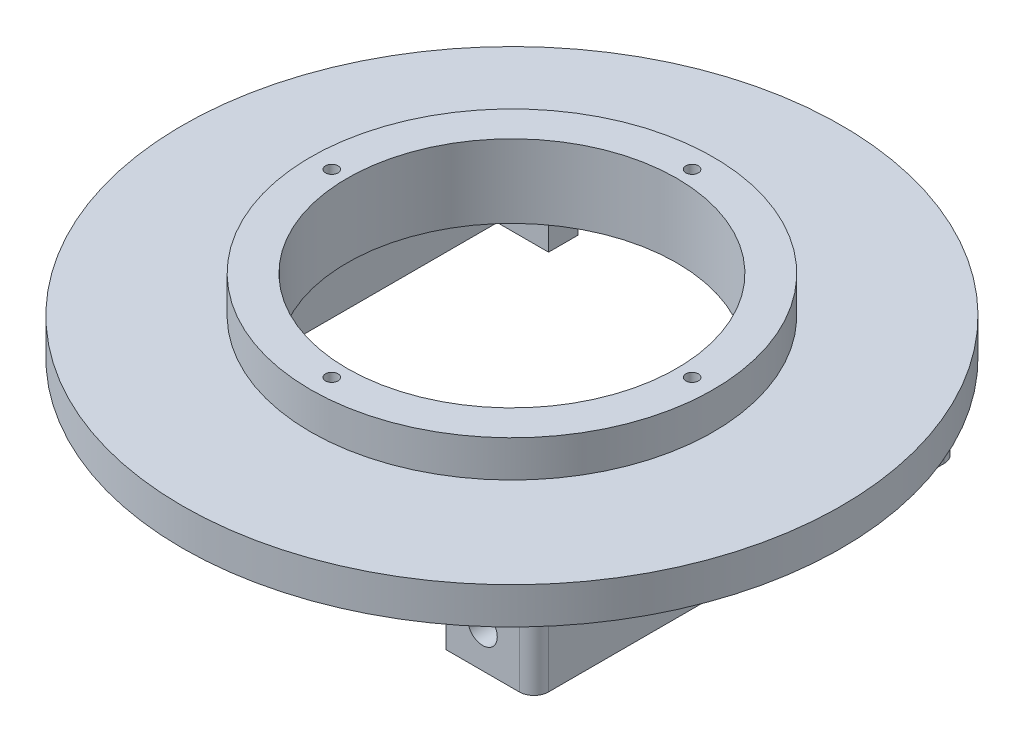
ISO-10303-21;
HEADER;
FILE_DESCRIPTION(('STEP AP214'),'2;1');
FILE_NAME('part.step','',(''),(''),'','','');
FILE_SCHEMA(('AUTOMOTIVE_DESIGN { 1 0 10303 214 1 1 1 1 }'));
ENDSEC;
DATA;
#1=APPLICATION_CONTEXT('core data for automotive mechanical design processes');
#2=APPLICATION_PROTOCOL_DEFINITION('international standard','automotive_design',2000,#1);
#3=PRODUCT_CONTEXT('',#1,'mechanical');
#4=PRODUCT('Part','Part','',(#3));
#5=PRODUCT_RELATED_PRODUCT_CATEGORY('part','',(#4));
#6=PRODUCT_DEFINITION_FORMATION('','',#4);
#7=PRODUCT_DEFINITION_CONTEXT('part definition',#1,'design');
#8=PRODUCT_DEFINITION('design','',#6,#7);
#9=PRODUCT_DEFINITION_SHAPE('','',#8);
#10=(LENGTH_UNIT() NAMED_UNIT(*) SI_UNIT(.MILLI.,.METRE.));
#11=(NAMED_UNIT(*) PLANE_ANGLE_UNIT() SI_UNIT($,.RADIAN.));
#12=(NAMED_UNIT(*) SI_UNIT($,.STERADIAN.) SOLID_ANGLE_UNIT());
#13=UNCERTAINTY_MEASURE_WITH_UNIT(LENGTH_MEASURE(1.E-05),#10,'distance_accuracy_value','');
#14=(GEOMETRIC_REPRESENTATION_CONTEXT(3) GLOBAL_UNCERTAINTY_ASSIGNED_CONTEXT((#13)) GLOBAL_UNIT_ASSIGNED_CONTEXT((#10,
#11,#12)) REPRESENTATION_CONTEXT('',''));
#15=CARTESIAN_POINT('',(0.,0.,0.));
#16=DIRECTION('',(0.,0.,1.));
#17=DIRECTION('',(1.,0.,0.));
#18=AXIS2_PLACEMENT_3D('',#15,#16,#17);
#19=CARTESIAN_POINT('',(0.,5.,0.));
#20=DIRECTION('',(0.,1.,0.));
#21=DIRECTION('',(0.,0.,1.));
#22=AXIS2_PLACEMENT_3D('',#19,#20,#21);
#23=PLANE('',#22);
#24=CARTESIAN_POINT('',(0.,5.,0.));
#25=DIRECTION('',(0.,1.,0.));
#26=DIRECTION('',(0.,0.,1.));
#27=AXIS2_PLACEMENT_3D('',#24,#25,#26);
#28=CIRCLE('',#27,45.);
#29=CARTESIAN_POINT('',(0.,5.,45.));
#30=VERTEX_POINT('',#29);
#31=EDGE_CURVE('E321',#30,#30,#28,.T.);
#32=ORIENTED_EDGE('',*,*,#31,.T.);
#33=EDGE_LOOP('',(#32));
#34=FACE_BOUND('',#33,.T.);
#35=CARTESIAN_POINT('',(0.,5.,0.));
#36=DIRECTION('',(0.,1.,0.));
#37=DIRECTION('',(0.,0.,1.));
#38=AXIS2_PLACEMENT_3D('',#35,#36,#37);
#39=CIRCLE('',#38,27.5);
#40=CARTESIAN_POINT('',(0.,5.,27.5));
#41=VERTEX_POINT('',#40);
#42=EDGE_CURVE('E519',#41,#41,#39,.T.);
#43=ORIENTED_EDGE('',*,*,#42,.F.);
#44=EDGE_LOOP('',(#43));
#45=FACE_BOUND('',#44,.T.);
#46=ADVANCED_FACE('F33',(#34,#45),#23,.T.);
#47=CARTESIAN_POINT('',(0.,0.,0.));
#48=DIRECTION('',(0.,1.,0.));
#49=DIRECTION('',(0.,0.,1.));
#50=AXIS2_PLACEMENT_3D('',#47,#48,#49);
#51=PLANE('',#50);
#52=CARTESIAN_POINT('',(-24.5999999999993,0.,6.99174051987939E-13));
#53=DIRECTION('',(0.,1.,0.));
#54=DIRECTION('',(0.,0.,1.));
#55=AXIS2_PLACEMENT_3D('',#52,#53,#54);
#56=CIRCLE('',#55,0.850000000001118);
#57=CARTESIAN_POINT('',(-24.5999999999993,0.,0.850000000001817));
#58=VERTEX_POINT('',#57);
#59=EDGE_CURVE('E772',#58,#58,#56,.T.);
#60=ORIENTED_EDGE('',*,*,#59,.T.);
#61=EDGE_LOOP('',(#60));
#62=FACE_BOUND('',#61,.T.);
#63=CARTESIAN_POINT('',(1.39304567458361E-12,0.,24.6));
#64=DIRECTION('',(0.,1.,0.));
#65=DIRECTION('',(0.,0.,1.));
#66=AXIS2_PLACEMENT_3D('',#63,#64,#65);
#67=CIRCLE('',#66,0.850000000001497);
#68=CARTESIAN_POINT('',(1.39304567458361E-12,0.,25.4500000000015));
#69=VERTEX_POINT('',#68);
#70=EDGE_CURVE('E776',#69,#69,#67,.T.);
#71=ORIENTED_EDGE('',*,*,#70,.T.);
#72=EDGE_LOOP('',(#71));
#73=FACE_BOUND('',#72,.T.);
#74=CARTESIAN_POINT('',(24.6000000000007,0.,-6.96161420862036E-13));
#75=DIRECTION('',(0.,1.,0.));
#76=DIRECTION('',(0.,0.,1.));
#77=AXIS2_PLACEMENT_3D('',#74,#75,#76);
#78=CIRCLE('',#77,0.850000000000545);
#79=CARTESIAN_POINT('',(24.6000000000007,0.,0.849999999999848));
#80=VERTEX_POINT('',#79);
#81=EDGE_CURVE('E785',#80,#80,#78,.T.);
#82=ORIENTED_EDGE('',*,*,#81,.T.);
#83=EDGE_LOOP('',(#82));
#84=FACE_BOUND('',#83,.T.);
#85=CARTESIAN_POINT('',(0.,0.,-24.6));
#86=DIRECTION('',(0.,1.,0.));
#87=DIRECTION('',(0.,0.,1.));
#88=AXIS2_PLACEMENT_3D('',#85,#86,#87);
#89=CIRCLE('',#88,0.85);
#90=CARTESIAN_POINT('',(0.,0.,-23.75));
#91=VERTEX_POINT('',#90);
#92=EDGE_CURVE('E520',#91,#91,#89,.T.);
#93=ORIENTED_EDGE('',*,*,#92,.T.);
#94=EDGE_LOOP('',(#93));
#95=FACE_BOUND('',#94,.T.);
#96=DIRECTION('',(1.,0.,0.));
#97=VECTOR('',#96,1.);
#98=CARTESIAN_POINT('',(-20.,0.,25.));
#99=LINE('',#98,#97);
#100=CARTESIAN_POINT('',(-27.,0.,25.));
#101=VERTEX_POINT('',#100);
#102=CARTESIAN_POINT('',(-20.,0.,25.));
#103=VERTEX_POINT('',#102);
#104=EDGE_CURVE('E201',#101,#103,#99,.T.);
#105=ORIENTED_EDGE('',*,*,#104,.F.);
#106=DIRECTION('',(0.,0.,1.));
#107=VECTOR('',#106,1.);
#108=CARTESIAN_POINT('',(-27.,0.,25.));
#109=LINE('',#108,#107);
#110=CARTESIAN_POINT('',(-27.,0.,-25.));
#111=VERTEX_POINT('',#110);
#112=EDGE_CURVE('E260',#111,#101,#109,.T.);
#113=ORIENTED_EDGE('',*,*,#112,.F.);
#114=DIRECTION('',(-1.,0.,0.));
#115=VECTOR('',#114,1.);
#116=CARTESIAN_POINT('',(-20.,0.,-25.));
#117=LINE('',#116,#115);
#118=CARTESIAN_POINT('',(-20.,0.,-25.));
#119=VERTEX_POINT('',#118);
#120=EDGE_CURVE('E293',#119,#111,#117,.T.);
#121=ORIENTED_EDGE('',*,*,#120,.F.);
#122=DIRECTION('',(0.,0.,1.));
#123=VECTOR('',#122,1.);
#124=CARTESIAN_POINT('',(-20.,0.,-29.));
#125=LINE('',#124,#123);
#126=CARTESIAN_POINT('',(-20.,0.,-29.));
#127=VERTEX_POINT('',#126);
#128=EDGE_CURVE('E290',#127,#119,#125,.T.);
#129=ORIENTED_EDGE('',*,*,#128,.F.);
#130=DIRECTION('',(1.,0.,0.));
#131=VECTOR('',#130,1.);
#132=CARTESIAN_POINT('',(-32.,0.,-29.));
#133=LINE('',#132,#131);
#134=CARTESIAN_POINT('',(-30.,0.,-29.));
#135=VERTEX_POINT('',#134);
#136=EDGE_CURVE('E288',#135,#127,#133,.T.);
#137=ORIENTED_EDGE('',*,*,#136,.F.);
#138=CARTESIAN_POINT('',(-30.,0.,-27.));
#139=DIRECTION('',(0.,1.,0.));
#140=DIRECTION('',(0.,0.,1.));
#141=AXIS2_PLACEMENT_3D('',#138,#139,#140);
#142=CIRCLE('',#141,2.);
#143=CARTESIAN_POINT('',(-32.,0.,-27.));
#144=VERTEX_POINT('',#143);
#145=EDGE_CURVE('E352',#135,#144,#142,.T.);
#146=ORIENTED_EDGE('',*,*,#145,.T.);
#147=DIRECTION('',(0.,0.,-1.));
#148=VECTOR('',#147,1.);
#149=CARTESIAN_POINT('',(-32.,0.,-25.));
#150=LINE('',#149,#148);
#151=CARTESIAN_POINT('',(-32.0000000000001,0.,27.));
#152=VERTEX_POINT('',#151);
#153=EDGE_CURVE('E285',#152,#144,#150,.T.);
#154=ORIENTED_EDGE('',*,*,#153,.F.);
#155=CARTESIAN_POINT('',(-30.0000000000001,0.,27.));
#156=DIRECTION('',(0.,1.,0.));
#157=DIRECTION('',(0.,0.,1.));
#158=AXIS2_PLACEMENT_3D('',#155,#156,#157);
#159=CIRCLE('',#158,2.);
#160=CARTESIAN_POINT('',(-30.0000000000001,0.,29.));
#161=VERTEX_POINT('',#160);
#162=EDGE_CURVE('E11',#152,#161,#159,.T.);
#163=ORIENTED_EDGE('',*,*,#162,.T.);
#164=DIRECTION('',(-1.,0.,0.));
#165=VECTOR('',#164,1.);
#166=CARTESIAN_POINT('',(-32.,0.,29.));
#167=LINE('',#166,#165);
#168=CARTESIAN_POINT('',(-20.,0.,29.));
#169=VERTEX_POINT('',#168);
#170=EDGE_CURVE('E282',#169,#161,#167,.T.);
#171=ORIENTED_EDGE('',*,*,#170,.F.);
#172=DIRECTION('',(0.,0.,1.));
#173=VECTOR('',#172,1.);
#174=CARTESIAN_POINT('',(-20.,0.,29.));
#175=LINE('',#174,#173);
#176=EDGE_CURVE('E279',#103,#169,#175,.T.);
#177=ORIENTED_EDGE('',*,*,#176,.F.);
#178=EDGE_LOOP('',(#105,#113,#121,#129,#137,#146,#154,#163,#171,#177));
#179=FACE_BOUND('',#178,.T.);
#180=CARTESIAN_POINT('',(0.,0.,0.));
#181=DIRECTION('',(0.,1.,0.));
#182=DIRECTION('',(0.,0.,1.));
#183=AXIS2_PLACEMENT_3D('',#180,#181,#182);
#184=CIRCLE('',#183,45.);
#185=CARTESIAN_POINT('',(0.,0.,45.));
#186=VERTEX_POINT('',#185);
#187=EDGE_CURVE('E320',#186,#186,#184,.T.);
#188=ORIENTED_EDGE('',*,*,#187,.F.);
#189=EDGE_LOOP('',(#188));
#190=FACE_BOUND('',#189,.T.);
#191=CARTESIAN_POINT('',(0.,0.,0.));
#192=DIRECTION('',(0.,1.,0.));
#193=DIRECTION('',(0.,0.,1.));
#194=AXIS2_PLACEMENT_3D('',#191,#192,#193);
#195=CIRCLE('',#194,22.5);
#196=CARTESIAN_POINT('',(0.,0.,22.5));
#197=VERTEX_POINT('',#196);
#198=EDGE_CURVE('E317',#197,#197,#195,.T.);
#199=ORIENTED_EDGE('',*,*,#198,.T.);
#200=EDGE_LOOP('',(#199));
#201=FACE_BOUND('',#200,.T.);
#202=DIRECTION('',(1.,0.,0.));
#203=VECTOR('',#202,1.);
#204=CARTESIAN_POINT('',(32.,0.,-29.));
#205=LINE('',#204,#203);
#206=CARTESIAN_POINT('',(20.,0.,-29.));
#207=VERTEX_POINT('',#206);
#208=CARTESIAN_POINT('',(30.0000000000003,0.,-29.));
#209=VERTEX_POINT('',#208);
#210=EDGE_CURVE('E219',#207,#209,#205,.T.);
#211=ORIENTED_EDGE('',*,*,#210,.F.);
#212=DIRECTION('',(0.,0.,-1.));
#213=VECTOR('',#212,1.);
#214=CARTESIAN_POINT('',(20.,0.,-29.));
#215=LINE('',#214,#213);
#216=CARTESIAN_POINT('',(20.,0.,-25.));
#217=VERTEX_POINT('',#216);
#218=EDGE_CURVE('E238',#217,#207,#215,.T.);
#219=ORIENTED_EDGE('',*,*,#218,.F.);
#220=DIRECTION('',(-1.,0.,0.));
#221=VECTOR('',#220,1.);
#222=CARTESIAN_POINT('',(20.,0.,-25.));
#223=LINE('',#222,#221);
#224=CARTESIAN_POINT('',(27.,0.,-25.));
#225=VERTEX_POINT('',#224);
#226=EDGE_CURVE('E235',#225,#217,#223,.T.);
#227=ORIENTED_EDGE('',*,*,#226,.F.);
#228=DIRECTION('',(0.,0.,-1.));
#229=VECTOR('',#228,1.);
#230=CARTESIAN_POINT('',(27.,0.,25.));
#231=LINE('',#230,#229);
#232=CARTESIAN_POINT('',(27.,0.,25.));
#233=VERTEX_POINT('',#232);
#234=EDGE_CURVE('E232',#233,#225,#231,.T.);
#235=ORIENTED_EDGE('',*,*,#234,.F.);
#236=DIRECTION('',(1.,0.,0.));
#237=VECTOR('',#236,1.);
#238=CARTESIAN_POINT('',(20.,0.,25.));
#239=LINE('',#238,#237);
#240=CARTESIAN_POINT('',(20.,0.,25.));
#241=VERTEX_POINT('',#240);
#242=EDGE_CURVE('E229',#241,#233,#239,.T.);
#243=ORIENTED_EDGE('',*,*,#242,.F.);
#244=DIRECTION('',(0.,0.,-1.));
#245=VECTOR('',#244,1.);
#246=CARTESIAN_POINT('',(20.,0.,29.));
#247=LINE('',#246,#245);
#248=CARTESIAN_POINT('',(20.,0.,29.));
#249=VERTEX_POINT('',#248);
#250=EDGE_CURVE('E227',#249,#241,#247,.T.);
#251=ORIENTED_EDGE('',*,*,#250,.F.);
#252=DIRECTION('',(-1.,0.,0.));
#253=VECTOR('',#252,1.);
#254=CARTESIAN_POINT('',(32.,0.,29.));
#255=LINE('',#254,#253);
#256=CARTESIAN_POINT('',(30.,0.,29.));
#257=VERTEX_POINT('',#256);
#258=EDGE_CURVE('E197',#257,#249,#255,.T.);
#259=ORIENTED_EDGE('',*,*,#258,.F.);
#260=CARTESIAN_POINT('',(30.,0.,27.));
#261=DIRECTION('',(0.,1.,0.));
#262=DIRECTION('',(0.,0.,1.));
#263=AXIS2_PLACEMENT_3D('',#260,#261,#262);
#264=CIRCLE('',#263,2.);
#265=CARTESIAN_POINT('',(32.,0.,27.));
#266=VERTEX_POINT('',#265);
#267=EDGE_CURVE('E42',#257,#266,#264,.T.);
#268=ORIENTED_EDGE('',*,*,#267,.T.);
#269=DIRECTION('',(0.,0.,1.));
#270=VECTOR('',#269,1.);
#271=CARTESIAN_POINT('',(32.,0.,25.));
#272=LINE('',#271,#270);
#273=CARTESIAN_POINT('',(32.0000000000003,0.,-27.));
#274=VERTEX_POINT('',#273);
#275=EDGE_CURVE('E222',#274,#266,#272,.T.);
#276=ORIENTED_EDGE('',*,*,#275,.F.);
#277=CARTESIAN_POINT('',(30.0000000000003,0.,-27.));
#278=DIRECTION('',(0.,1.,0.));
#279=DIRECTION('',(0.,0.,1.));
#280=AXIS2_PLACEMENT_3D('',#277,#278,#279);
#281=CIRCLE('',#280,2.);
#282=EDGE_CURVE('E354',#274,#209,#281,.T.);
#283=ORIENTED_EDGE('',*,*,#282,.T.);
#284=EDGE_LOOP('',(#211,#219,#227,#235,#243,#251,#259,#268,#276,#283));
#285=FACE_BOUND('',#284,.T.);
#286=ADVANCED_FACE('F358',(#62,#73,#84,#95,#179,#190,#201,#285),#51,.F.);
#287=CARTESIAN_POINT('',(0.,5.,0.));
#288=DIRECTION('',(0.,-1.,0.));
#289=DIRECTION('',(0.,0.,-1.));
#290=AXIS2_PLACEMENT_3D('',#287,#288,#289);
#291=CYLINDRICAL_SURFACE('',#290,45.);
#292=ORIENTED_EDGE('',*,*,#31,.F.);
#293=EDGE_LOOP('',(#292));
#294=FACE_BOUND('',#293,.T.);
#295=ORIENTED_EDGE('',*,*,#187,.T.);
#296=EDGE_LOOP('',(#295));
#297=FACE_BOUND('',#296,.T.);
#298=ADVANCED_FACE('F385',(#294,#297),#291,.T.);
#299=CARTESIAN_POINT('',(0.,5.,0.));
#300=DIRECTION('',(0.,-1.,0.));
#301=DIRECTION('',(0.,0.,-1.));
#302=AXIS2_PLACEMENT_3D('',#299,#300,#301);
#303=CYLINDRICAL_SURFACE('',#302,22.5);
#304=ORIENTED_EDGE('',*,*,#198,.F.);
#305=EDGE_LOOP('',(#304));
#306=FACE_BOUND('',#305,.T.);
#307=CARTESIAN_POINT('',(0.,10.,0.));
#308=DIRECTION('',(0.,1.,0.));
#309=DIRECTION('',(0.,0.,1.));
#310=AXIS2_PLACEMENT_3D('',#307,#308,#309);
#311=CIRCLE('',#310,22.5);
#312=CARTESIAN_POINT('',(0.,10.,22.5));
#313=VERTEX_POINT('',#312);
#314=EDGE_CURVE('E517',#313,#313,#311,.T.);
#315=ORIENTED_EDGE('',*,*,#314,.T.);
#316=EDGE_LOOP('',(#315));
#317=FACE_BOUND('',#316,.T.);
#318=ADVANCED_FACE('F390',(#306,#317),#303,.F.);
#319=CARTESIAN_POINT('',(-20.,-10.,25.));
#320=DIRECTION('',(0.,0.,1.));
#321=DIRECTION('',(1.,0.,0.));
#322=AXIS2_PLACEMENT_3D('',#319,#320,#321);
#323=PLANE('',#322);
#324=DIRECTION('',(0.,1.,0.));
#325=VECTOR('',#324,1.);
#326=CARTESIAN_POINT('',(-27.,-10.,25.));
#327=LINE('',#326,#325);
#328=CARTESIAN_POINT('',(-27.,-10.,25.));
#329=VERTEX_POINT('',#328);
#330=CARTESIAN_POINT('',(-27.,-5.,25.));
#331=VERTEX_POINT('',#330);
#332=EDGE_CURVE('E298',#329,#331,#327,.T.);
#333=ORIENTED_EDGE('',*,*,#332,.T.);
#334=CARTESIAN_POINT('',(-25.,-5.,25.));
#335=DIRECTION('',(0.,0.,1.));
#336=DIRECTION('',(1.,0.,0.));
#337=AXIS2_PLACEMENT_3D('',#334,#335,#336);
#338=CIRCLE('',#337,2.);
#339=EDGE_CURVE('E452',#331,#331,#338,.T.);
#340=ORIENTED_EDGE('',*,*,#339,.T.);
#341=EDGE_CURVE('E276',#331,#101,#327,.T.);
#342=ORIENTED_EDGE('',*,*,#341,.T.);
#343=ORIENTED_EDGE('',*,*,#104,.T.);
#344=DIRECTION('',(0.,1.,0.));
#345=VECTOR('',#344,1.);
#346=CARTESIAN_POINT('',(-20.,-10.,25.));
#347=LINE('',#346,#345);
#348=CARTESIAN_POINT('',(-20.,-10.,25.));
#349=VERTEX_POINT('',#348);
#350=EDGE_CURVE('E314',#349,#103,#347,.T.);
#351=ORIENTED_EDGE('',*,*,#350,.F.);
#352=DIRECTION('',(1.,0.,0.));
#353=VECTOR('',#352,1.);
#354=CARTESIAN_POINT('',(-20.,-10.,25.));
#355=LINE('',#354,#353);
#356=EDGE_CURVE('E256',#329,#349,#355,.T.);
#357=ORIENTED_EDGE('',*,*,#356,.F.);
#358=EDGE_LOOP('',(#333,#340,#342,#343,#351,#357));
#359=FACE_BOUND('',#358,.T.);
#360=ADVANCED_FACE('F435',(#359),#323,.F.);
#361=CARTESIAN_POINT('',(-20.,-10.,29.));
#362=DIRECTION('',(-1.,0.,0.));
#363=DIRECTION('',(0.,0.,1.));
#364=AXIS2_PLACEMENT_3D('',#361,#362,#363);
#365=PLANE('',#364);
#366=ORIENTED_EDGE('',*,*,#176,.T.);
#367=DIRECTION('',(0.,1.,0.));
#368=VECTOR('',#367,1.);
#369=CARTESIAN_POINT('',(-20.,-10.,29.));
#370=LINE('',#369,#368);
#371=CARTESIAN_POINT('',(-20.,-10.,29.));
#372=VERTEX_POINT('',#371);
#373=EDGE_CURVE('E311',#372,#169,#370,.T.);
#374=ORIENTED_EDGE('',*,*,#373,.F.);
#375=DIRECTION('',(0.,0.,1.));
#376=VECTOR('',#375,1.);
#377=CARTESIAN_POINT('',(-20.,-10.,29.));
#378=LINE('',#377,#376);
#379=EDGE_CURVE('E259',#349,#372,#378,.T.);
#380=ORIENTED_EDGE('',*,*,#379,.F.);
#381=ORIENTED_EDGE('',*,*,#350,.T.);
#382=EDGE_LOOP('',(#366,#374,#380,#381));
#383=FACE_BOUND('',#382,.T.);
#384=ADVANCED_FACE('F440',(#383),#365,.F.);
#385=CARTESIAN_POINT('',(-32.,-10.,29.));
#386=DIRECTION('',(0.,0.,-1.));
#387=DIRECTION('',(-1.,0.,0.));
#388=AXIS2_PLACEMENT_3D('',#385,#386,#387);
#389=PLANE('',#388);
#390=CARTESIAN_POINT('',(-25.,-5.,29.));
#391=DIRECTION('',(0.,0.,1.));
#392=DIRECTION('',(1.,0.,0.));
#393=AXIS2_PLACEMENT_3D('',#390,#391,#392);
#394=CIRCLE('',#393,2.);
#395=CARTESIAN_POINT('',(-23.,-5.,29.));
#396=VERTEX_POINT('',#395);
#397=EDGE_CURVE('E457',#396,#396,#394,.T.);
#398=ORIENTED_EDGE('',*,*,#397,.F.);
#399=EDGE_LOOP('',(#398));
#400=FACE_BOUND('',#399,.T.);
#401=ORIENTED_EDGE('',*,*,#170,.T.);
#402=DIRECTION('',(0.,1.,0.));
#403=VECTOR('',#402,1.);
#404=CARTESIAN_POINT('',(-30.0000000000001,-10.,29.));
#405=LINE('',#404,#403);
#406=CARTESIAN_POINT('',(-30.0000000000001,-10.,29.));
#407=VERTEX_POINT('',#406);
#408=EDGE_CURVE('E350',#161,#407,#405,.F.);
#409=ORIENTED_EDGE('',*,*,#408,.T.);
#410=DIRECTION('',(-1.,0.,0.));
#411=VECTOR('',#410,1.);
#412=CARTESIAN_POINT('',(-32.,-10.,29.));
#413=LINE('',#412,#411);
#414=EDGE_CURVE('E262',#372,#407,#413,.T.);
#415=ORIENTED_EDGE('',*,*,#414,.F.);
#416=ORIENTED_EDGE('',*,*,#373,.T.);
#417=EDGE_LOOP('',(#401,#409,#415,#416));
#418=FACE_BOUND('',#417,.T.);
#419=ADVANCED_FACE('F442',(#400,#418),#389,.F.);
#420=CARTESIAN_POINT('',(-32.,-10.,-25.));
#421=DIRECTION('',(1.,0.,0.));
#422=DIRECTION('',(0.,0.,-1.));
#423=AXIS2_PLACEMENT_3D('',#420,#421,#422);
#424=PLANE('',#423);
#425=ORIENTED_EDGE('',*,*,#153,.T.);
#426=DIRECTION('',(0.,1.,0.));
#427=VECTOR('',#426,1.);
#428=CARTESIAN_POINT('',(-32.,-10.,-27.));
#429=LINE('',#428,#427);
#430=CARTESIAN_POINT('',(-32.0000000000001,-10.,-27.));
#431=VERTEX_POINT('',#430);
#432=EDGE_CURVE('E332',#144,#431,#429,.F.);
#433=ORIENTED_EDGE('',*,*,#432,.T.);
#434=DIRECTION('',(0.,0.,-1.));
#435=VECTOR('',#434,1.);
#436=CARTESIAN_POINT('',(-32.,-10.,25.));
#437=LINE('',#436,#435);
#438=CARTESIAN_POINT('',(-32.,-10.,27.));
#439=VERTEX_POINT('',#438);
#440=EDGE_CURVE('E265',#439,#431,#437,.T.);
#441=ORIENTED_EDGE('',*,*,#440,.F.);
#442=DIRECTION('',(0.,1.,0.));
#443=VECTOR('',#442,1.);
#444=CARTESIAN_POINT('',(-32.0000000000001,-10.,27.));
#445=LINE('',#444,#443);
#446=EDGE_CURVE('E329',#439,#152,#445,.T.);
#447=ORIENTED_EDGE('',*,*,#446,.T.);
#448=EDGE_LOOP('',(#425,#433,#441,#447));
#449=FACE_BOUND('',#448,.T.);
#450=ADVANCED_FACE('F446',(#449),#424,.F.);
#451=CARTESIAN_POINT('',(-32.,-10.,-29.));
#452=DIRECTION('',(0.,0.,1.));
#453=DIRECTION('',(1.,0.,0.));
#454=AXIS2_PLACEMENT_3D('',#451,#452,#453);
#455=PLANE('',#454);
#456=CARTESIAN_POINT('',(-25.,-5.,-29.));
#457=DIRECTION('',(0.,0.,1.));
#458=DIRECTION('',(1.,0.,0.));
#459=AXIS2_PLACEMENT_3D('',#456,#457,#458);
#460=CIRCLE('',#459,2.);
#461=CARTESIAN_POINT('',(-23.,-5.,-29.));
#462=VERTEX_POINT('',#461);
#463=EDGE_CURVE('E223',#462,#462,#460,.T.);
#464=ORIENTED_EDGE('',*,*,#463,.T.);
#465=EDGE_LOOP('',(#464));
#466=FACE_BOUND('',#465,.T.);
#467=DIRECTION('',(1.,0.,0.));
#468=VECTOR('',#467,1.);
#469=CARTESIAN_POINT('',(-32.,-10.,-29.));
#470=LINE('',#469,#468);
#471=CARTESIAN_POINT('',(-30.,-10.,-29.));
#472=VERTEX_POINT('',#471);
#473=CARTESIAN_POINT('',(-20.,-10.,-29.));
#474=VERTEX_POINT('',#473);
#475=EDGE_CURVE('E268',#472,#474,#470,.T.);
#476=ORIENTED_EDGE('',*,*,#475,.F.);
#477=DIRECTION('',(0.,1.,0.));
#478=VECTOR('',#477,1.);
#479=CARTESIAN_POINT('',(-30.,-10.,-29.));
#480=LINE('',#479,#478);
#481=EDGE_CURVE('E324',#472,#135,#480,.T.);
#482=ORIENTED_EDGE('',*,*,#481,.T.);
#483=ORIENTED_EDGE('',*,*,#136,.T.);
#484=DIRECTION('',(0.,1.,0.));
#485=VECTOR('',#484,1.);
#486=CARTESIAN_POINT('',(-20.,-10.,-29.));
#487=LINE('',#486,#485);
#488=EDGE_CURVE('E308',#474,#127,#487,.T.);
#489=ORIENTED_EDGE('',*,*,#488,.F.);
#490=EDGE_LOOP('',(#476,#482,#483,#489));
#491=FACE_BOUND('',#490,.T.);
#492=ADVANCED_FACE('F412',(#466,#491),#455,.F.);
#493=CARTESIAN_POINT('',(-20.,-10.,-29.));
#494=DIRECTION('',(-1.,0.,0.));
#495=DIRECTION('',(0.,0.,1.));
#496=AXIS2_PLACEMENT_3D('',#493,#494,#495);
#497=PLANE('',#496);
#498=ORIENTED_EDGE('',*,*,#128,.T.);
#499=DIRECTION('',(0.,1.,0.));
#500=VECTOR('',#499,1.);
#501=CARTESIAN_POINT('',(-20.,-10.,-25.));
#502=LINE('',#501,#500);
#503=CARTESIAN_POINT('',(-20.,-10.,-25.));
#504=VERTEX_POINT('',#503);
#505=EDGE_CURVE('E305',#504,#119,#502,.T.);
#506=ORIENTED_EDGE('',*,*,#505,.F.);
#507=DIRECTION('',(0.,0.,1.));
#508=VECTOR('',#507,1.);
#509=CARTESIAN_POINT('',(-20.,-10.,-29.));
#510=LINE('',#509,#508);
#511=EDGE_CURVE('E270',#474,#504,#510,.T.);
#512=ORIENTED_EDGE('',*,*,#511,.F.);
#513=ORIENTED_EDGE('',*,*,#488,.T.);
#514=EDGE_LOOP('',(#498,#506,#512,#513));
#515=FACE_BOUND('',#514,.T.);
#516=ADVANCED_FACE('F418',(#515),#497,.F.);
#517=CARTESIAN_POINT('',(-20.,-10.,-25.));
#518=DIRECTION('',(0.,0.,-1.));
#519=DIRECTION('',(-1.,0.,0.));
#520=AXIS2_PLACEMENT_3D('',#517,#518,#519);
#521=PLANE('',#520);
#522=DIRECTION('',(0.,1.,0.));
#523=VECTOR('',#522,1.);
#524=CARTESIAN_POINT('',(-27.,-10.,-25.));
#525=LINE('',#524,#523);
#526=CARTESIAN_POINT('',(-27.,-5.,-25.));
#527=VERTEX_POINT('',#526);
#528=EDGE_CURVE('E301',#527,#111,#525,.T.);
#529=ORIENTED_EDGE('',*,*,#528,.F.);
#530=CARTESIAN_POINT('',(-25.,-5.,-25.));
#531=DIRECTION('',(0.,0.,-1.));
#532=DIRECTION('',(-1.,0.,0.));
#533=AXIS2_PLACEMENT_3D('',#530,#531,#532);
#534=CIRCLE('',#533,2.);
#535=EDGE_CURVE('E427',#527,#527,#534,.T.);
#536=ORIENTED_EDGE('',*,*,#535,.T.);
#537=CARTESIAN_POINT('',(-27.,-10.,-25.));
#538=VERTEX_POINT('',#537);
#539=EDGE_CURVE('E302',#538,#527,#525,.T.);
#540=ORIENTED_EDGE('',*,*,#539,.F.);
#541=DIRECTION('',(-1.,0.,0.));
#542=VECTOR('',#541,1.);
#543=CARTESIAN_POINT('',(-20.,-10.,-25.));
#544=LINE('',#543,#542);
#545=EDGE_CURVE('E272',#504,#538,#544,.T.);
#546=ORIENTED_EDGE('',*,*,#545,.F.);
#547=ORIENTED_EDGE('',*,*,#505,.T.);
#548=ORIENTED_EDGE('',*,*,#120,.T.);
#549=EDGE_LOOP('',(#529,#536,#540,#546,#547,#548));
#550=FACE_BOUND('',#549,.T.);
#551=ADVANCED_FACE('F426',(#550),#521,.F.);
#552=CARTESIAN_POINT('',(-27.,-10.,25.));
#553=DIRECTION('',(-1.,0.,0.));
#554=DIRECTION('',(0.,0.,1.));
#555=AXIS2_PLACEMENT_3D('',#552,#553,#554);
#556=PLANE('',#555);
#557=ORIENTED_EDGE('',*,*,#539,.T.);
#558=ORIENTED_EDGE('',*,*,#528,.T.);
#559=ORIENTED_EDGE('',*,*,#112,.T.);
#560=ORIENTED_EDGE('',*,*,#341,.F.);
#561=ORIENTED_EDGE('',*,*,#332,.F.);
#562=DIRECTION('',(0.,0.,1.));
#563=VECTOR('',#562,1.);
#564=CARTESIAN_POINT('',(-27.,-10.,25.));
#565=LINE('',#564,#563);
#566=EDGE_CURVE('E274',#538,#329,#565,.T.);
#567=ORIENTED_EDGE('',*,*,#566,.F.);
#568=EDGE_LOOP('',(#557,#558,#559,#560,#561,#567));
#569=FACE_BOUND('',#568,.T.);
#570=ADVANCED_FACE('F429',(#569),#556,.F.);
#571=CARTESIAN_POINT('',(0.,-10.,0.));
#572=DIRECTION('',(0.,-1.,0.));
#573=DIRECTION('',(0.,0.,-1.));
#574=AXIS2_PLACEMENT_3D('',#571,#572,#573);
#575=PLANE('',#574);
#576=ORIENTED_EDGE('',*,*,#440,.T.);
#577=CARTESIAN_POINT('',(-30.,-10.,-27.));
#578=DIRECTION('',(0.,-1.,0.));
#579=DIRECTION('',(0.,0.,-1.));
#580=AXIS2_PLACEMENT_3D('',#577,#578,#579);
#581=CIRCLE('',#580,2.);
#582=EDGE_CURVE('E336',#431,#472,#581,.T.);
#583=ORIENTED_EDGE('',*,*,#582,.T.);
#584=ORIENTED_EDGE('',*,*,#475,.T.);
#585=ORIENTED_EDGE('',*,*,#511,.T.);
#586=ORIENTED_EDGE('',*,*,#545,.T.);
#587=ORIENTED_EDGE('',*,*,#566,.T.);
#588=ORIENTED_EDGE('',*,*,#356,.T.);
#589=ORIENTED_EDGE('',*,*,#379,.T.);
#590=ORIENTED_EDGE('',*,*,#414,.T.);
#591=CARTESIAN_POINT('',(-30.0000000000001,-10.,27.));
#592=DIRECTION('',(0.,-1.,0.));
#593=DIRECTION('',(0.,0.,-1.));
#594=AXIS2_PLACEMENT_3D('',#591,#592,#593);
#595=CIRCLE('',#594,2.);
#596=EDGE_CURVE('E334',#407,#439,#595,.T.);
#597=ORIENTED_EDGE('',*,*,#596,.T.);
#598=EDGE_LOOP('',(#576,#583,#584,#585,#586,#587,#588,#589,#590,#597));
#599=FACE_BOUND('',#598,.T.);
#600=ADVANCED_FACE('F408',(#599),#575,.T.);
#601=CARTESIAN_POINT('',(32.,-10.,-29.));
#602=DIRECTION('',(0.,0.,1.));
#603=DIRECTION('',(1.,0.,0.));
#604=AXIS2_PLACEMENT_3D('',#601,#602,#603);
#605=PLANE('',#604);
#606=CARTESIAN_POINT('',(25.0000000000004,-4.99999999999948,-29.));
#607=DIRECTION('',(0.,0.,1.));
#608=DIRECTION('',(1.,0.,0.));
#609=AXIS2_PLACEMENT_3D('',#606,#607,#608);
#610=CIRCLE('',#609,2.);
#611=CARTESIAN_POINT('',(27.0000000000004,-4.99999999999948,-29.));
#612=VERTEX_POINT('',#611);
#613=EDGE_CURVE('E484',#612,#612,#610,.T.);
#614=ORIENTED_EDGE('',*,*,#613,.T.);
#615=EDGE_LOOP('',(#614));
#616=FACE_BOUND('',#615,.T.);
#617=ORIENTED_EDGE('',*,*,#210,.T.);
#618=DIRECTION('',(0.,1.,0.));
#619=VECTOR('',#618,1.);
#620=CARTESIAN_POINT('',(30.0000000000003,-10.,-29.));
#621=LINE('',#620,#619);
#622=CARTESIAN_POINT('',(30.0000000000003,-10.,-29.));
#623=VERTEX_POINT('',#622);
#624=EDGE_CURVE('E343',#209,#623,#621,.F.);
#625=ORIENTED_EDGE('',*,*,#624,.T.);
#626=DIRECTION('',(1.,0.,0.));
#627=VECTOR('',#626,1.);
#628=CARTESIAN_POINT('',(32.,-10.,-29.));
#629=LINE('',#628,#627);
#630=CARTESIAN_POINT('',(20.,-10.,-29.));
#631=VERTEX_POINT('',#630);
#632=EDGE_CURVE('E241',#631,#623,#629,.T.);
#633=ORIENTED_EDGE('',*,*,#632,.F.);
#634=DIRECTION('',(0.,1.,0.));
#635=VECTOR('',#634,1.);
#636=CARTESIAN_POINT('',(20.,-10.,-29.));
#637=LINE('',#636,#635);
#638=EDGE_CURVE('E218',#631,#207,#637,.T.);
#639=ORIENTED_EDGE('',*,*,#638,.T.);
#640=EDGE_LOOP('',(#617,#625,#633,#639));
#641=FACE_BOUND('',#640,.T.);
#642=ADVANCED_FACE('F464',(#616,#641),#605,.F.);
#643=CARTESIAN_POINT('',(32.,-10.,25.));
#644=DIRECTION('',(-1.,0.,0.));
#645=DIRECTION('',(0.,0.,1.));
#646=AXIS2_PLACEMENT_3D('',#643,#644,#645);
#647=PLANE('',#646);
#648=DIRECTION('',(0.,0.,1.));
#649=VECTOR('',#648,1.);
#650=CARTESIAN_POINT('',(32.,-10.,-25.));
#651=LINE('',#650,#649);
#652=CARTESIAN_POINT('',(32.,-10.,-27.));
#653=VERTEX_POINT('',#652);
#654=CARTESIAN_POINT('',(32.0000000000003,-10.,27.));
#655=VERTEX_POINT('',#654);
#656=EDGE_CURVE('E191',#653,#655,#651,.T.);
#657=ORIENTED_EDGE('',*,*,#656,.F.);
#658=DIRECTION('',(0.,1.,0.));
#659=VECTOR('',#658,1.);
#660=CARTESIAN_POINT('',(32.0000000000003,-10.,-27.));
#661=LINE('',#660,#659);
#662=EDGE_CURVE('E340',#653,#274,#661,.T.);
#663=ORIENTED_EDGE('',*,*,#662,.T.);
#664=ORIENTED_EDGE('',*,*,#275,.T.);
#665=DIRECTION('',(0.,1.,0.));
#666=VECTOR('',#665,1.);
#667=CARTESIAN_POINT('',(32.,-10.,27.));
#668=LINE('',#667,#666);
#669=EDGE_CURVE('E338',#266,#655,#668,.F.);
#670=ORIENTED_EDGE('',*,*,#669,.T.);
#671=EDGE_LOOP('',(#657,#663,#664,#670));
#672=FACE_BOUND('',#671,.T.);
#673=ADVANCED_FACE('F363',(#672),#647,.F.);
#674=CARTESIAN_POINT('',(32.,-10.,29.));
#675=DIRECTION('',(0.,0.,-1.));
#676=DIRECTION('',(-1.,0.,0.));
#677=AXIS2_PLACEMENT_3D('',#674,#675,#676);
#678=PLANE('',#677);
#679=CARTESIAN_POINT('',(25.0000000000004,-4.99999999999948,29.));
#680=DIRECTION('',(0.,0.,1.));
#681=DIRECTION('',(-1.,0.,0.));
#682=AXIS2_PLACEMENT_3D('',#679,#680,#681);
#683=CIRCLE('',#682,2.);
#684=CARTESIAN_POINT('',(23.0000000000004,-4.99999999999948,29.));
#685=VERTEX_POINT('',#684);
#686=EDGE_CURVE('E488',#685,#685,#683,.T.);
#687=ORIENTED_EDGE('',*,*,#686,.F.);
#688=EDGE_LOOP('',(#687));
#689=FACE_BOUND('',#688,.T.);
#690=DIRECTION('',(-1.,0.,0.));
#691=VECTOR('',#690,1.);
#692=CARTESIAN_POINT('',(32.,-10.,29.));
#693=LINE('',#692,#691);
#694=CARTESIAN_POINT('',(30.,-10.,29.));
#695=VERTEX_POINT('',#694);
#696=CARTESIAN_POINT('',(20.,-10.,29.));
#697=VERTEX_POINT('',#696);
#698=EDGE_CURVE('E178',#695,#697,#693,.T.);
#699=ORIENTED_EDGE('',*,*,#698,.F.);
#700=DIRECTION('',(0.,1.,0.));
#701=VECTOR('',#700,1.);
#702=CARTESIAN_POINT('',(30.,-10.,29.));
#703=LINE('',#702,#701);
#704=EDGE_CURVE('E348',#695,#257,#703,.T.);
#705=ORIENTED_EDGE('',*,*,#704,.T.);
#706=ORIENTED_EDGE('',*,*,#258,.T.);
#707=DIRECTION('',(0.,1.,0.));
#708=VECTOR('',#707,1.);
#709=CARTESIAN_POINT('',(20.,-10.,29.));
#710=LINE('',#709,#708);
#711=EDGE_CURVE('E194',#697,#249,#710,.T.);
#712=ORIENTED_EDGE('',*,*,#711,.F.);
#713=EDGE_LOOP('',(#699,#705,#706,#712));
#714=FACE_BOUND('',#713,.T.);
#715=ADVANCED_FACE('F195',(#689,#714),#678,.F.);
#716=CARTESIAN_POINT('',(20.,-10.,29.));
#717=DIRECTION('',(1.,0.,0.));
#718=DIRECTION('',(0.,0.,-1.));
#719=AXIS2_PLACEMENT_3D('',#716,#717,#718);
#720=PLANE('',#719);
#721=ORIENTED_EDGE('',*,*,#250,.T.);
#722=DIRECTION('',(0.,1.,0.));
#723=VECTOR('',#722,1.);
#724=CARTESIAN_POINT('',(20.,-10.,25.));
#725=LINE('',#724,#723);
#726=CARTESIAN_POINT('',(20.,-10.,25.));
#727=VERTEX_POINT('',#726);
#728=EDGE_CURVE('E202',#727,#241,#725,.T.);
#729=ORIENTED_EDGE('',*,*,#728,.F.);
#730=DIRECTION('',(0.,0.,-1.));
#731=VECTOR('',#730,1.);
#732=CARTESIAN_POINT('',(20.,-10.,29.));
#733=LINE('',#732,#731);
#734=EDGE_CURVE('E183',#697,#727,#733,.T.);
#735=ORIENTED_EDGE('',*,*,#734,.F.);
#736=ORIENTED_EDGE('',*,*,#711,.T.);
#737=EDGE_LOOP('',(#721,#729,#735,#736));
#738=FACE_BOUND('',#737,.T.);
#739=ADVANCED_FACE('F204',(#738),#720,.F.);
#740=CARTESIAN_POINT('',(20.,-10.,25.));
#741=DIRECTION('',(0.,0.,1.));
#742=DIRECTION('',(1.,0.,0.));
#743=AXIS2_PLACEMENT_3D('',#740,#741,#742);
#744=PLANE('',#743);
#745=DIRECTION('',(0.,1.,0.));
#746=VECTOR('',#745,1.);
#747=CARTESIAN_POINT('',(27.,-10.,25.));
#748=LINE('',#747,#746);
#749=CARTESIAN_POINT('',(27.,-4.99999999999948,25.));
#750=VERTEX_POINT('',#749);
#751=EDGE_CURVE('E251',#750,#233,#748,.T.);
#752=ORIENTED_EDGE('',*,*,#751,.F.);
#753=CARTESIAN_POINT('',(25.0000000000004,-4.99999999999948,25.));
#754=DIRECTION('',(0.,0.,1.));
#755=DIRECTION('',(1.,0.,0.));
#756=AXIS2_PLACEMENT_3D('',#753,#754,#755);
#757=CIRCLE('',#756,2.);
#758=EDGE_CURVE('E47',#750,#750,#757,.T.);
#759=ORIENTED_EDGE('',*,*,#758,.T.);
#760=CARTESIAN_POINT('',(27.,-10.,25.));
#761=VERTEX_POINT('',#760);
#762=EDGE_CURVE('E252',#761,#750,#748,.T.);
#763=ORIENTED_EDGE('',*,*,#762,.F.);
#764=DIRECTION('',(1.,0.,0.));
#765=VECTOR('',#764,1.);
#766=CARTESIAN_POINT('',(20.,-10.,25.));
#767=LINE('',#766,#765);
#768=EDGE_CURVE('E207',#727,#761,#767,.T.);
#769=ORIENTED_EDGE('',*,*,#768,.F.);
#770=ORIENTED_EDGE('',*,*,#728,.T.);
#771=ORIENTED_EDGE('',*,*,#242,.T.);
#772=EDGE_LOOP('',(#752,#759,#763,#769,#770,#771));
#773=FACE_BOUND('',#772,.T.);
#774=ADVANCED_FACE('F483',(#773),#744,.F.);
#775=CARTESIAN_POINT('',(27.,-10.,25.));
#776=DIRECTION('',(1.,0.,0.));
#777=DIRECTION('',(0.,0.,-1.));
#778=AXIS2_PLACEMENT_3D('',#775,#776,#777);
#779=PLANE('',#778);
#780=DIRECTION('',(0.,1.,0.));
#781=VECTOR('',#780,1.);
#782=CARTESIAN_POINT('',(27.,-10.,-25.));
#783=LINE('',#782,#781);
#784=CARTESIAN_POINT('',(27.,-4.99999999999948,-25.));
#785=VERTEX_POINT('',#784);
#786=EDGE_CURVE('E247',#785,#225,#783,.T.);
#787=ORIENTED_EDGE('',*,*,#786,.F.);
#788=CARTESIAN_POINT('',(27.,-10.,-25.));
#789=VERTEX_POINT('',#788);
#790=EDGE_CURVE('E248',#789,#785,#783,.T.);
#791=ORIENTED_EDGE('',*,*,#790,.F.);
#792=DIRECTION('',(0.,0.,-1.));
#793=VECTOR('',#792,1.);
#794=CARTESIAN_POINT('',(27.,-10.,25.));
#795=LINE('',#794,#793);
#796=EDGE_CURVE('E209',#761,#789,#795,.T.);
#797=ORIENTED_EDGE('',*,*,#796,.F.);
#798=ORIENTED_EDGE('',*,*,#762,.T.);
#799=ORIENTED_EDGE('',*,*,#751,.T.);
#800=ORIENTED_EDGE('',*,*,#234,.T.);
#801=EDGE_LOOP('',(#787,#791,#797,#798,#799,#800));
#802=FACE_BOUND('',#801,.T.);
#803=ADVANCED_FACE('F478',(#802),#779,.F.);
#804=CARTESIAN_POINT('',(20.,-10.,-25.));
#805=DIRECTION('',(0.,0.,-1.));
#806=DIRECTION('',(-1.,0.,0.));
#807=AXIS2_PLACEMENT_3D('',#804,#805,#806);
#808=PLANE('',#807);
#809=ORIENTED_EDGE('',*,*,#790,.T.);
#810=CARTESIAN_POINT('',(25.0000000000004,-4.99999999999948,-25.));
#811=DIRECTION('',(0.,0.,-1.));
#812=DIRECTION('',(-1.,0.,0.));
#813=AXIS2_PLACEMENT_3D('',#810,#811,#812);
#814=CIRCLE('',#813,2.);
#815=EDGE_CURVE('E37',#785,#785,#814,.T.);
#816=ORIENTED_EDGE('',*,*,#815,.T.);
#817=ORIENTED_EDGE('',*,*,#786,.T.);
#818=ORIENTED_EDGE('',*,*,#226,.T.);
#819=DIRECTION('',(0.,1.,0.));
#820=VECTOR('',#819,1.);
#821=CARTESIAN_POINT('',(20.,-10.,-25.));
#822=LINE('',#821,#820);
#823=CARTESIAN_POINT('',(20.,-10.,-25.));
#824=VERTEX_POINT('',#823);
#825=EDGE_CURVE('E244',#824,#217,#822,.T.);
#826=ORIENTED_EDGE('',*,*,#825,.F.);
#827=DIRECTION('',(-1.,0.,0.));
#828=VECTOR('',#827,1.);
#829=CARTESIAN_POINT('',(20.,-10.,-25.));
#830=LINE('',#829,#828);
#831=EDGE_CURVE('E214',#789,#824,#830,.T.);
#832=ORIENTED_EDGE('',*,*,#831,.F.);
#833=EDGE_LOOP('',(#809,#816,#817,#818,#826,#832));
#834=FACE_BOUND('',#833,.T.);
#835=ADVANCED_FACE('F473',(#834),#808,.F.);
#836=CARTESIAN_POINT('',(20.,-10.,-29.));
#837=DIRECTION('',(1.,0.,0.));
#838=DIRECTION('',(0.,0.,-1.));
#839=AXIS2_PLACEMENT_3D('',#836,#837,#838);
#840=PLANE('',#839);
#841=ORIENTED_EDGE('',*,*,#218,.T.);
#842=ORIENTED_EDGE('',*,*,#638,.F.);
#843=DIRECTION('',(0.,0.,-1.));
#844=VECTOR('',#843,1.);
#845=CARTESIAN_POINT('',(20.,-10.,-29.));
#846=LINE('',#845,#844);
#847=EDGE_CURVE('E216',#824,#631,#846,.T.);
#848=ORIENTED_EDGE('',*,*,#847,.F.);
#849=ORIENTED_EDGE('',*,*,#825,.T.);
#850=EDGE_LOOP('',(#841,#842,#848,#849));
#851=FACE_BOUND('',#850,.T.);
#852=ADVANCED_FACE('F401',(#851),#840,.F.);
#853=CARTESIAN_POINT('',(0.,-10.,0.));
#854=DIRECTION('',(0.,1.,0.));
#855=DIRECTION('',(0.,0.,1.));
#856=AXIS2_PLACEMENT_3D('',#853,#854,#855);
#857=PLANE('',#856);
#858=ORIENTED_EDGE('',*,*,#632,.T.);
#859=CARTESIAN_POINT('',(30.0000000000003,-10.,-27.));
#860=DIRECTION('',(0.,1.,0.));
#861=DIRECTION('',(0.,0.,1.));
#862=AXIS2_PLACEMENT_3D('',#859,#860,#861);
#863=CIRCLE('',#862,2.);
#864=EDGE_CURVE('E346',#623,#653,#863,.F.);
#865=ORIENTED_EDGE('',*,*,#864,.T.);
#866=ORIENTED_EDGE('',*,*,#656,.T.);
#867=CARTESIAN_POINT('',(30.,-10.,27.));
#868=DIRECTION('',(0.,1.,0.));
#869=DIRECTION('',(0.,0.,1.));
#870=AXIS2_PLACEMENT_3D('',#867,#868,#869);
#871=CIRCLE('',#870,2.);
#872=EDGE_CURVE('E187',#655,#695,#871,.F.);
#873=ORIENTED_EDGE('',*,*,#872,.T.);
#874=ORIENTED_EDGE('',*,*,#698,.T.);
#875=ORIENTED_EDGE('',*,*,#734,.T.);
#876=ORIENTED_EDGE('',*,*,#768,.T.);
#877=ORIENTED_EDGE('',*,*,#796,.T.);
#878=ORIENTED_EDGE('',*,*,#831,.T.);
#879=ORIENTED_EDGE('',*,*,#847,.T.);
#880=EDGE_LOOP('',(#858,#865,#866,#873,#874,#875,#876,#877,#878,#879));
#881=FACE_BOUND('',#880,.T.);
#882=ADVANCED_FACE('F181',(#881),#857,.F.);
#883=CARTESIAN_POINT('',(-30.,-10.,-27.));
#884=DIRECTION('',(0.,1.,0.));
#885=DIRECTION('',(0.,0.,1.));
#886=AXIS2_PLACEMENT_3D('',#883,#884,#885);
#887=CYLINDRICAL_SURFACE('',#886,2.);
#888=ORIENTED_EDGE('',*,*,#582,.F.);
#889=ORIENTED_EDGE('',*,*,#432,.F.);
#890=ORIENTED_EDGE('',*,*,#145,.F.);
#891=ORIENTED_EDGE('',*,*,#481,.F.);
#892=EDGE_LOOP('',(#888,#889,#890,#891));
#893=FACE_BOUND('',#892,.T.);
#894=ADVANCED_FACE('F374',(#893),#887,.T.);
#895=CARTESIAN_POINT('',(30.0000000000003,-10.,-27.));
#896=DIRECTION('',(0.,1.,0.));
#897=DIRECTION('',(0.,0.,1.));
#898=AXIS2_PLACEMENT_3D('',#895,#896,#897);
#899=CYLINDRICAL_SURFACE('',#898,2.);
#900=ORIENTED_EDGE('',*,*,#864,.F.);
#901=ORIENTED_EDGE('',*,*,#624,.F.);
#902=ORIENTED_EDGE('',*,*,#282,.F.);
#903=ORIENTED_EDGE('',*,*,#662,.F.);
#904=EDGE_LOOP('',(#900,#901,#902,#903));
#905=FACE_BOUND('',#904,.T.);
#906=ADVANCED_FACE('F367',(#905),#899,.T.);
#907=CARTESIAN_POINT('',(30.,-10.,27.));
#908=DIRECTION('',(0.,1.,0.));
#909=DIRECTION('',(0.,0.,1.));
#910=AXIS2_PLACEMENT_3D('',#907,#908,#909);
#911=CYLINDRICAL_SURFACE('',#910,2.);
#912=ORIENTED_EDGE('',*,*,#872,.F.);
#913=ORIENTED_EDGE('',*,*,#669,.F.);
#914=ORIENTED_EDGE('',*,*,#267,.F.);
#915=ORIENTED_EDGE('',*,*,#704,.F.);
#916=EDGE_LOOP('',(#912,#913,#914,#915));
#917=FACE_BOUND('',#916,.T.);
#918=ADVANCED_FACE('F365',(#917),#911,.T.);
#919=CARTESIAN_POINT('',(-30.0000000000001,-10.,27.));
#920=DIRECTION('',(0.,1.,0.));
#921=DIRECTION('',(0.,0.,1.));
#922=AXIS2_PLACEMENT_3D('',#919,#920,#921);
#923=CYLINDRICAL_SURFACE('',#922,2.);
#924=ORIENTED_EDGE('',*,*,#596,.F.);
#925=ORIENTED_EDGE('',*,*,#408,.F.);
#926=ORIENTED_EDGE('',*,*,#162,.F.);
#927=ORIENTED_EDGE('',*,*,#446,.F.);
#928=EDGE_LOOP('',(#924,#925,#926,#927));
#929=FACE_BOUND('',#928,.T.);
#930=ADVANCED_FACE('F35',(#929),#923,.T.);
#931=CARTESIAN_POINT('',(-25.,-5.,-45.));
#932=DIRECTION('',(0.,0.,1.));
#933=DIRECTION('',(1.,0.,0.));
#934=AXIS2_PLACEMENT_3D('',#931,#932,#933);
#935=CYLINDRICAL_SURFACE('',#934,2.);
#936=ORIENTED_EDGE('',*,*,#535,.F.);
#937=EDGE_LOOP('',(#936));
#938=FACE_BOUND('',#937,.T.);
#939=ORIENTED_EDGE('',*,*,#463,.F.);
#940=EDGE_LOOP('',(#939));
#941=FACE_BOUND('',#940,.T.);
#942=ADVANCED_FACE('F372',(#938,#941),#935,.F.);
#943=ORIENTED_EDGE('',*,*,#397,.T.);
#944=EDGE_LOOP('',(#943));
#945=FACE_BOUND('',#944,.T.);
#946=ORIENTED_EDGE('',*,*,#339,.F.);
#947=EDGE_LOOP('',(#946));
#948=FACE_BOUND('',#947,.T.);
#949=ADVANCED_FACE('F494',(#945,#948),#935,.F.);
#950=CARTESIAN_POINT('',(25.0000000000004,-4.99999999999948,-45.));
#951=DIRECTION('',(0.,0.,1.));
#952=DIRECTION('',(1.,0.,0.));
#953=AXIS2_PLACEMENT_3D('',#950,#951,#952);
#954=CYLINDRICAL_SURFACE('',#953,2.);
#955=ORIENTED_EDGE('',*,*,#815,.F.);
#956=EDGE_LOOP('',(#955));
#957=FACE_BOUND('',#956,.T.);
#958=ORIENTED_EDGE('',*,*,#613,.F.);
#959=EDGE_LOOP('',(#958));
#960=FACE_BOUND('',#959,.T.);
#961=ADVANCED_FACE('F569',(#957,#960),#954,.F.);
#962=ORIENTED_EDGE('',*,*,#686,.T.);
#963=EDGE_LOOP('',(#962));
#964=FACE_BOUND('',#963,.T.);
#965=ORIENTED_EDGE('',*,*,#758,.F.);
#966=EDGE_LOOP('',(#965));
#967=FACE_BOUND('',#966,.T.);
#968=ADVANCED_FACE('F535',(#964,#967),#954,.F.);
#969=CARTESIAN_POINT('',(0.,10.,0.));
#970=DIRECTION('',(0.,1.,0.));
#971=DIRECTION('',(0.,0.,1.));
#972=AXIS2_PLACEMENT_3D('',#969,#970,#971);
#973=PLANE('',#972);
#974=CARTESIAN_POINT('',(-24.5999999999993,10.,6.99174051987939E-13));
#975=DIRECTION('',(0.,1.,0.));
#976=DIRECTION('',(0.,0.,1.));
#977=AXIS2_PLACEMENT_3D('',#974,#975,#976);
#978=CIRCLE('',#977,0.850000000001118);
#979=CARTESIAN_POINT('',(-24.5999999999993,10.,0.850000000001817));
#980=VERTEX_POINT('',#979);
#981=EDGE_CURVE('E769',#980,#980,#978,.T.);
#982=ORIENTED_EDGE('',*,*,#981,.F.);
#983=EDGE_LOOP('',(#982));
#984=FACE_BOUND('',#983,.T.);
#985=CARTESIAN_POINT('',(1.39304567458361E-12,10.,24.6));
#986=DIRECTION('',(0.,1.,0.));
#987=DIRECTION('',(0.,0.,1.));
#988=AXIS2_PLACEMENT_3D('',#985,#986,#987);
#989=CIRCLE('',#988,0.850000000001497);
#990=CARTESIAN_POINT('',(1.39304567458361E-12,10.,25.4500000000015));
#991=VERTEX_POINT('',#990);
#992=EDGE_CURVE('E773',#991,#991,#989,.T.);
#993=ORIENTED_EDGE('',*,*,#992,.F.);
#994=EDGE_LOOP('',(#993));
#995=FACE_BOUND('',#994,.T.);
#996=CARTESIAN_POINT('',(24.6000000000007,10.,-6.96161420862036E-13));
#997=DIRECTION('',(0.,1.,0.));
#998=DIRECTION('',(0.,0.,1.));
#999=AXIS2_PLACEMENT_3D('',#996,#997,#998);
#1000=CIRCLE('',#999,0.850000000000545);
#1001=CARTESIAN_POINT('',(24.6000000000007,10.,0.849999999999848));
#1002=VERTEX_POINT('',#1001);
#1003=EDGE_CURVE('E782',#1002,#1002,#1000,.T.);
#1004=ORIENTED_EDGE('',*,*,#1003,.F.);
#1005=EDGE_LOOP('',(#1004));
#1006=FACE_BOUND('',#1005,.T.);
#1007=CARTESIAN_POINT('',(0.,10.,-24.6));
#1008=DIRECTION('',(0.,1.,0.));
#1009=DIRECTION('',(0.,0.,1.));
#1010=AXIS2_PLACEMENT_3D('',#1007,#1008,#1009);
#1011=CIRCLE('',#1010,0.85);
#1012=CARTESIAN_POINT('',(0.,10.,-23.75));
#1013=VERTEX_POINT('',#1012);
#1014=EDGE_CURVE('E525',#1013,#1013,#1011,.T.);
#1015=ORIENTED_EDGE('',*,*,#1014,.F.);
#1016=EDGE_LOOP('',(#1015));
#1017=FACE_BOUND('',#1016,.T.);
#1018=CARTESIAN_POINT('',(0.,10.,0.));
#1019=DIRECTION('',(0.,1.,0.));
#1020=DIRECTION('',(0.,0.,1.));
#1021=AXIS2_PLACEMENT_3D('',#1018,#1019,#1020);
#1022=CIRCLE('',#1021,27.5);
#1023=CARTESIAN_POINT('',(0.,10.,27.5));
#1024=VERTEX_POINT('',#1023);
#1025=EDGE_CURVE('E523',#1024,#1024,#1022,.T.);
#1026=ORIENTED_EDGE('',*,*,#1025,.T.);
#1027=EDGE_LOOP('',(#1026));
#1028=FACE_BOUND('',#1027,.T.);
#1029=ORIENTED_EDGE('',*,*,#314,.F.);
#1030=EDGE_LOOP('',(#1029));
#1031=FACE_BOUND('',#1030,.T.);
#1032=ADVANCED_FACE('F713',(#984,#995,#1006,#1017,#1028,#1031),#973,.T.);
#1033=CARTESIAN_POINT('',(0.,10.,0.));
#1034=DIRECTION('',(0.,-1.,0.));
#1035=DIRECTION('',(0.,0.,-1.));
#1036=AXIS2_PLACEMENT_3D('',#1033,#1034,#1035);
#1037=CYLINDRICAL_SURFACE('',#1036,27.5);
#1038=ORIENTED_EDGE('',*,*,#1025,.F.);
#1039=EDGE_LOOP('',(#1038));
#1040=FACE_BOUND('',#1039,.T.);
#1041=ORIENTED_EDGE('',*,*,#42,.T.);
#1042=EDGE_LOOP('',(#1041));
#1043=FACE_BOUND('',#1042,.T.);
#1044=ADVANCED_FACE('F709',(#1040,#1043),#1037,.T.);
#1045=CARTESIAN_POINT('',(0.,-10.,-24.6));
#1046=DIRECTION('',(0.,1.,0.));
#1047=DIRECTION('',(0.,0.,1.));
#1048=AXIS2_PLACEMENT_3D('',#1045,#1046,#1047);
#1049=CYLINDRICAL_SURFACE('',#1048,0.85);
#1050=ORIENTED_EDGE('',*,*,#1014,.T.);
#1051=EDGE_LOOP('',(#1050));
#1052=FACE_BOUND('',#1051,.T.);
#1053=ORIENTED_EDGE('',*,*,#92,.F.);
#1054=EDGE_LOOP('',(#1053));
#1055=FACE_BOUND('',#1054,.T.);
#1056=ADVANCED_FACE('F723',(#1052,#1055),#1049,.F.);
#1057=CARTESIAN_POINT('',(24.6000000000007,-10.,-6.96161420862036E-13));
#1058=DIRECTION('',(0.,1.,0.));
#1059=DIRECTION('',(0.,0.,1.));
#1060=AXIS2_PLACEMENT_3D('',#1057,#1058,#1059);
#1061=CYLINDRICAL_SURFACE('',#1060,0.850000000000545);
#1062=ORIENTED_EDGE('',*,*,#1003,.T.);
#1063=EDGE_LOOP('',(#1062));
#1064=FACE_BOUND('',#1063,.T.);
#1065=ORIENTED_EDGE('',*,*,#81,.F.);
#1066=EDGE_LOOP('',(#1065));
#1067=FACE_BOUND('',#1066,.T.);
#1068=ADVANCED_FACE('F728',(#1064,#1067),#1061,.F.);
#1069=CARTESIAN_POINT('',(1.39304567458361E-12,-10.,24.6));
#1070=DIRECTION('',(0.,1.,0.));
#1071=DIRECTION('',(0.,0.,1.));
#1072=AXIS2_PLACEMENT_3D('',#1069,#1070,#1071);
#1073=CYLINDRICAL_SURFACE('',#1072,0.850000000001497);
#1074=ORIENTED_EDGE('',*,*,#992,.T.);
#1075=EDGE_LOOP('',(#1074));
#1076=FACE_BOUND('',#1075,.T.);
#1077=ORIENTED_EDGE('',*,*,#70,.F.);
#1078=EDGE_LOOP('',(#1077));
#1079=FACE_BOUND('',#1078,.T.);
#1080=ADVANCED_FACE('F738',(#1076,#1079),#1073,.F.);
#1081=CARTESIAN_POINT('',(-24.5999999999993,-10.,6.99174051987939E-13));
#1082=DIRECTION('',(0.,1.,0.));
#1083=DIRECTION('',(0.,0.,1.));
#1084=AXIS2_PLACEMENT_3D('',#1081,#1082,#1083);
#1085=CYLINDRICAL_SURFACE('',#1084,0.850000000001118);
#1086=ORIENTED_EDGE('',*,*,#981,.T.);
#1087=EDGE_LOOP('',(#1086));
#1088=FACE_BOUND('',#1087,.T.);
#1089=ORIENTED_EDGE('',*,*,#59,.F.);
#1090=EDGE_LOOP('',(#1089));
#1091=FACE_BOUND('',#1090,.T.);
#1092=ADVANCED_FACE('F748',(#1088,#1091),#1085,.F.);
#1093=CLOSED_SHELL('',(#46,#286,#298,#318,#360,#384,#419,#450,#492,#516,#551,#570,#600,#642,
#673,#715,#739,#774,#803,#835,#852,#882,#894,#906,#918,#930,#942,#949,#961,#968,#1032,#1044,
#1056,#1068,#1080,#1092));
#1094=MANIFOLD_SOLID_BREP('B2',#1093);
#1095=ADVANCED_BREP_SHAPE_REPRESENTATION('',(#18,#1094),#14);
#1096=SHAPE_DEFINITION_REPRESENTATION(#9,#1095);
ENDSEC;
END-ISO-10303-21;
